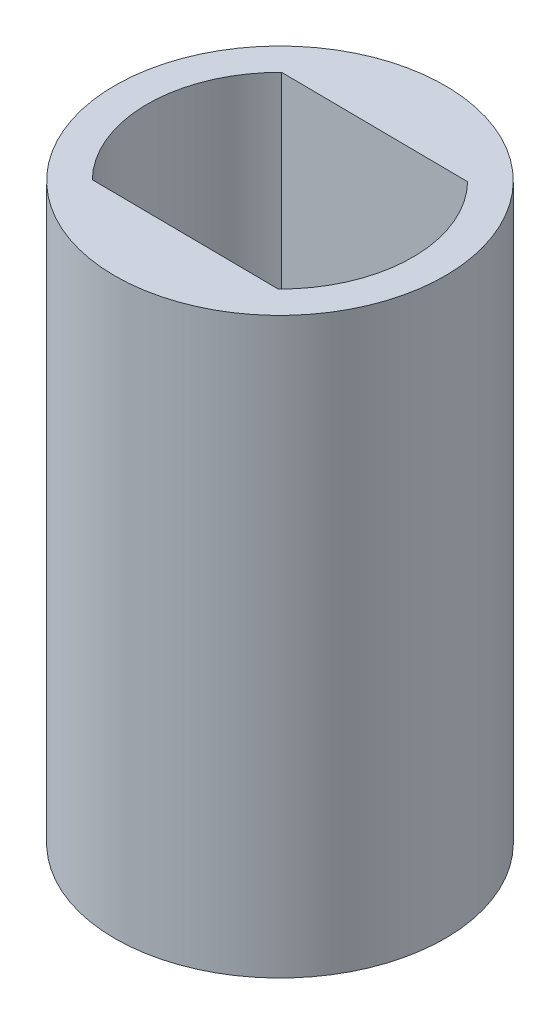
ISO-10303-21;
HEADER;
FILE_DESCRIPTION(('STEP AP214'),'2;1');
FILE_NAME('part.step','',(''),(''),'','','');
FILE_SCHEMA(('AUTOMOTIVE_DESIGN { 1 0 10303 214 1 1 1 1 }'));
ENDSEC;
DATA;
#1=APPLICATION_CONTEXT('core data for automotive mechanical design processes');
#2=APPLICATION_PROTOCOL_DEFINITION('international standard','automotive_design',2000,#1);
#3=PRODUCT_CONTEXT('',#1,'mechanical');
#4=PRODUCT('Part','Part','',(#3));
#5=PRODUCT_RELATED_PRODUCT_CATEGORY('part','',(#4));
#6=PRODUCT_DEFINITION_FORMATION('','',#4);
#7=PRODUCT_DEFINITION_CONTEXT('part definition',#1,'design');
#8=PRODUCT_DEFINITION('design','',#6,#7);
#9=PRODUCT_DEFINITION_SHAPE('','',#8);
#10=(LENGTH_UNIT() NAMED_UNIT(*) SI_UNIT(.MILLI.,.METRE.));
#11=(NAMED_UNIT(*) PLANE_ANGLE_UNIT() SI_UNIT($,.RADIAN.));
#12=(NAMED_UNIT(*) SI_UNIT($,.STERADIAN.) SOLID_ANGLE_UNIT());
#13=UNCERTAINTY_MEASURE_WITH_UNIT(LENGTH_MEASURE(1.E-05),#10,'distance_accuracy_value','');
#14=(GEOMETRIC_REPRESENTATION_CONTEXT(3) GLOBAL_UNCERTAINTY_ASSIGNED_CONTEXT((#13)) GLOBAL_UNIT_ASSIGNED_CONTEXT((#10,
#11,#12)) REPRESENTATION_CONTEXT('',''));
#15=CARTESIAN_POINT('',(0.,0.,0.));
#16=DIRECTION('',(0.,0.,1.));
#17=DIRECTION('',(1.,0.,0.));
#18=AXIS2_PLACEMENT_3D('',#15,#16,#17);
#19=CARTESIAN_POINT('',(0.,6.,0.));
#20=DIRECTION('',(0.,1.,0.));
#21=DIRECTION('',(0.,0.,1.));
#22=AXIS2_PLACEMENT_3D('',#19,#20,#21);
#23=PLANE('',#22);
#24=DIRECTION('',(1.,0.,0.));
#25=VECTOR('',#24,1.);
#26=CARTESIAN_POINT('',(0.,6.,0.95));
#27=LINE('',#26,#25);
#28=CARTESIAN_POINT('',(0.95,6.,0.95));
#29=VERTEX_POINT('',#28);
#30=CARTESIAN_POINT('',(2.44,6.,0.95));
#31=VERTEX_POINT('',#30);
#32=EDGE_CURVE('E202',#29,#31,#27,.T.);
#33=ORIENTED_EDGE('',*,*,#32,.F.);
#34=DIRECTION('',(0.,0.,1.));
#35=VECTOR('',#34,1.);
#36=CARTESIAN_POINT('',(0.95,6.,0.));
#37=LINE('',#36,#35);
#38=CARTESIAN_POINT('',(0.95,6.,1.97121051126905));
#39=VERTEX_POINT('',#38);
#40=EDGE_CURVE('E205',#29,#39,#37,.T.);
#41=ORIENTED_EDGE('',*,*,#40,.T.);
#42=DIRECTION('',(-0.999956089376776,0.,-0.00937119620456276));
#43=VECTOR('',#42,1.);
#44=CARTESIAN_POINT('',(-0.0183883609658107,6.,1.96213515543169));
#45=LINE('',#44,#43);
#46=CARTESIAN_POINT('',(1.9437467944659,6.,1.9805235163975));
#47=VERTEX_POINT('',#46);
#48=EDGE_CURVE('E264',#47,#39,#45,.T.);
#49=ORIENTED_EDGE('',*,*,#48,.F.);
#50=CARTESIAN_POINT('',(0.,6.,0.));
#51=DIRECTION('',(0.,1.,0.));
#52=DIRECTION('',(0.,0.,1.));
#53=AXIS2_PLACEMENT_3D('',#50,#51,#52);
#54=CIRCLE('',#53,2.775);
#55=CARTESIAN_POINT('',(1.9805235163975,6.,-1.94374679446591));
#56=VERTEX_POINT('',#55);
#57=EDGE_CURVE('E267',#47,#56,#54,.T.);
#58=ORIENTED_EDGE('',*,*,#57,.T.);
#59=DIRECTION('',(-0.999956089376777,0.,-0.00937119620454811));
#60=VECTOR('',#59,1.);
#61=CARTESIAN_POINT('',(0.0183883609657819,6.,-1.96213515543169));
#62=LINE('',#61,#60);
#63=CARTESIAN_POINT('',(0.95,6.,-1.95340445660543));
#64=VERTEX_POINT('',#63);
#65=EDGE_CURVE('E273',#56,#64,#62,.T.);
#66=ORIENTED_EDGE('',*,*,#65,.T.);
#67=DIRECTION('',(0.,0.,1.));
#68=VECTOR('',#67,1.);
#69=CARTESIAN_POINT('',(0.95,6.,0.));
#70=LINE('',#69,#68);
#71=CARTESIAN_POINT('',(0.95,6.,-0.95));
#72=VERTEX_POINT('',#71);
#73=EDGE_CURVE('E193',#64,#72,#70,.T.);
#74=ORIENTED_EDGE('',*,*,#73,.T.);
#75=DIRECTION('',(1.,0.,0.));
#76=VECTOR('',#75,1.);
#77=CARTESIAN_POINT('',(0.,6.,-0.95));
#78=LINE('',#77,#76);
#79=CARTESIAN_POINT('',(2.44,6.,-0.95));
#80=VERTEX_POINT('',#79);
#81=EDGE_CURVE('E197',#72,#80,#78,.T.);
#82=ORIENTED_EDGE('',*,*,#81,.T.);
#83=DIRECTION('',(0.,0.,-1.));
#84=VECTOR('',#83,1.);
#85=CARTESIAN_POINT('',(2.44,6.,0.));
#86=LINE('',#85,#84);
#87=EDGE_CURVE('E200',#31,#80,#86,.T.);
#88=ORIENTED_EDGE('',*,*,#87,.F.);
#89=EDGE_LOOP('',(#33,#41,#49,#58,#66,#74,#82,#88));
#90=FACE_BOUND('',#89,.T.);
#91=ADVANCED_FACE('F33',(#90),#23,.T.);
#92=CARTESIAN_POINT('',(0.,0.,0.));
#93=DIRECTION('',(0.,1.,0.));
#94=DIRECTION('',(0.,0.,1.));
#95=AXIS2_PLACEMENT_3D('',#92,#93,#94);
#96=PLANE('',#95);
#97=CARTESIAN_POINT('',(0.,0.,0.));
#98=DIRECTION('',(0.,1.,0.));
#99=DIRECTION('',(0.,0.,1.));
#100=AXIS2_PLACEMENT_3D('',#97,#98,#99);
#101=CIRCLE('',#100,3.45);
#102=CARTESIAN_POINT('',(0.,0.,3.45));
#103=VERTEX_POINT('',#102);
#104=EDGE_CURVE('E37',#103,#103,#101,.T.);
#105=ORIENTED_EDGE('',*,*,#104,.F.);
#106=EDGE_LOOP('',(#105));
#107=FACE_BOUND('',#106,.T.);
#108=DIRECTION('',(0.,0.,1.));
#109=VECTOR('',#108,1.);
#110=CARTESIAN_POINT('',(-0.95,0.,0.));
#111=LINE('',#110,#109);
#112=CARTESIAN_POINT('',(-0.95,0.,0.95));
#113=VERTEX_POINT('',#112);
#114=CARTESIAN_POINT('',(-0.95,0.,2.44));
#115=VERTEX_POINT('',#114);
#116=EDGE_CURVE('E56',#113,#115,#111,.T.);
#117=ORIENTED_EDGE('',*,*,#116,.T.);
#118=DIRECTION('',(1.,0.,0.));
#119=VECTOR('',#118,1.);
#120=CARTESIAN_POINT('',(0.,0.,2.44));
#121=LINE('',#120,#119);
#122=CARTESIAN_POINT('',(0.95,0.,2.44));
#123=VERTEX_POINT('',#122);
#124=EDGE_CURVE('E180',#115,#123,#121,.T.);
#125=ORIENTED_EDGE('',*,*,#124,.T.);
#126=DIRECTION('',(0.,0.,1.));
#127=VECTOR('',#126,1.);
#128=CARTESIAN_POINT('',(0.95,0.,0.));
#129=LINE('',#128,#127);
#130=CARTESIAN_POINT('',(0.95,0.,0.95));
#131=VERTEX_POINT('',#130);
#132=EDGE_CURVE('E237',#131,#123,#129,.T.);
#133=ORIENTED_EDGE('',*,*,#132,.F.);
#134=DIRECTION('',(1.,0.,0.));
#135=VECTOR('',#134,1.);
#136=CARTESIAN_POINT('',(0.,0.,0.95));
#137=LINE('',#136,#135);
#138=CARTESIAN_POINT('',(2.44,0.,0.95));
#139=VERTEX_POINT('',#138);
#140=EDGE_CURVE('E234',#131,#139,#137,.T.);
#141=ORIENTED_EDGE('',*,*,#140,.T.);
#142=DIRECTION('',(0.,0.,-1.));
#143=VECTOR('',#142,1.);
#144=CARTESIAN_POINT('',(2.44,0.,0.));
#145=LINE('',#144,#143);
#146=CARTESIAN_POINT('',(2.44,0.,-0.95));
#147=VERTEX_POINT('',#146);
#148=EDGE_CURVE('E231',#139,#147,#145,.T.);
#149=ORIENTED_EDGE('',*,*,#148,.T.);
#150=DIRECTION('',(1.,0.,0.));
#151=VECTOR('',#150,1.);
#152=CARTESIAN_POINT('',(0.,0.,-0.95));
#153=LINE('',#152,#151);
#154=CARTESIAN_POINT('',(0.95,0.,-0.95));
#155=VERTEX_POINT('',#154);
#156=EDGE_CURVE('E228',#155,#147,#153,.T.);
#157=ORIENTED_EDGE('',*,*,#156,.F.);
#158=DIRECTION('',(0.,0.,1.));
#159=VECTOR('',#158,1.);
#160=CARTESIAN_POINT('',(0.95,0.,0.));
#161=LINE('',#160,#159);
#162=CARTESIAN_POINT('',(0.95,0.,-2.44));
#163=VERTEX_POINT('',#162);
#164=EDGE_CURVE('E225',#163,#155,#161,.T.);
#165=ORIENTED_EDGE('',*,*,#164,.F.);
#166=DIRECTION('',(1.,0.,0.));
#167=VECTOR('',#166,1.);
#168=CARTESIAN_POINT('',(0.,0.,-2.44));
#169=LINE('',#168,#167);
#170=CARTESIAN_POINT('',(-0.95,0.,-2.44));
#171=VERTEX_POINT('',#170);
#172=EDGE_CURVE('E222',#171,#163,#169,.T.);
#173=ORIENTED_EDGE('',*,*,#172,.F.);
#174=DIRECTION('',(0.,0.,1.));
#175=VECTOR('',#174,1.);
#176=CARTESIAN_POINT('',(-0.95,0.,0.));
#177=LINE('',#176,#175);
#178=CARTESIAN_POINT('',(-0.95,0.,-0.95));
#179=VERTEX_POINT('',#178);
#180=EDGE_CURVE('E219',#171,#179,#177,.T.);
#181=ORIENTED_EDGE('',*,*,#180,.T.);
#182=DIRECTION('',(1.,0.,0.));
#183=VECTOR('',#182,1.);
#184=CARTESIAN_POINT('',(0.,0.,-0.95));
#185=LINE('',#184,#183);
#186=CARTESIAN_POINT('',(-2.44,0.,-0.95));
#187=VERTEX_POINT('',#186);
#188=EDGE_CURVE('E216',#187,#179,#185,.T.);
#189=ORIENTED_EDGE('',*,*,#188,.F.);
#190=DIRECTION('',(0.,0.,-1.));
#191=VECTOR('',#190,1.);
#192=CARTESIAN_POINT('',(-2.44,0.,0.));
#193=LINE('',#192,#191);
#194=CARTESIAN_POINT('',(-2.44,0.,0.95));
#195=VERTEX_POINT('',#194);
#196=EDGE_CURVE('E213',#195,#187,#193,.T.);
#197=ORIENTED_EDGE('',*,*,#196,.F.);
#198=DIRECTION('',(1.,0.,0.));
#199=VECTOR('',#198,1.);
#200=CARTESIAN_POINT('',(0.,0.,0.95));
#201=LINE('',#200,#199);
#202=EDGE_CURVE('E211',#195,#113,#201,.T.);
#203=ORIENTED_EDGE('',*,*,#202,.T.);
#204=EDGE_LOOP('',(#117,#125,#133,#141,#149,#157,#165,#173,#181,#189,#197,#203));
#205=FACE_BOUND('',#204,.T.);
#206=ADVANCED_FACE('F331',(#107,#205),#96,.F.);
#207=CARTESIAN_POINT('',(0.,12.,0.));
#208=DIRECTION('',(0.,1.,0.));
#209=DIRECTION('',(0.,0.,1.));
#210=AXIS2_PLACEMENT_3D('',#207,#208,#209);
#211=PLANE('',#210);
#212=CARTESIAN_POINT('',(0.,12.,0.));
#213=DIRECTION('',(0.,1.,0.));
#214=DIRECTION('',(0.,0.,1.));
#215=AXIS2_PLACEMENT_3D('',#212,#213,#214);
#216=CIRCLE('',#215,3.45);
#217=CARTESIAN_POINT('',(0.,12.,3.45));
#218=VERTEX_POINT('',#217);
#219=EDGE_CURVE('E11',#218,#218,#216,.T.);
#220=ORIENTED_EDGE('',*,*,#219,.T.);
#221=EDGE_LOOP('',(#220));
#222=FACE_BOUND('',#221,.T.);
#223=CARTESIAN_POINT('',(0.,12.,0.));
#224=DIRECTION('',(0.,1.,0.));
#225=DIRECTION('',(0.,0.,1.));
#226=AXIS2_PLACEMENT_3D('',#223,#224,#225);
#227=CIRCLE('',#226,2.775);
#228=CARTESIAN_POINT('',(1.9437467944659,12.,1.9805235163975));
#229=VERTEX_POINT('',#228);
#230=CARTESIAN_POINT('',(1.9805235163975,12.,-1.94374679446591));
#231=VERTEX_POINT('',#230);
#232=EDGE_CURVE('E279',#229,#231,#227,.T.);
#233=ORIENTED_EDGE('',*,*,#232,.F.);
#234=DIRECTION('',(-0.999956089376776,0.,-0.00937119620456276));
#235=VECTOR('',#234,1.);
#236=CARTESIAN_POINT('',(-0.0183883609658107,12.,1.96213515543169));
#237=LINE('',#236,#235);
#238=CARTESIAN_POINT('',(-1.98052351639752,12.,1.94374679446588));
#239=VERTEX_POINT('',#238);
#240=EDGE_CURVE('E244',#229,#239,#237,.T.);
#241=ORIENTED_EDGE('',*,*,#240,.T.);
#242=CARTESIAN_POINT('',(-1.94374679446593,12.,-1.98052351639747));
#243=VERTEX_POINT('',#242);
#244=EDGE_CURVE('E283',#243,#239,#227,.T.);
#245=ORIENTED_EDGE('',*,*,#244,.F.);
#246=DIRECTION('',(-0.999956089376777,0.,-0.00937119620454811));
#247=VECTOR('',#246,1.);
#248=CARTESIAN_POINT('',(0.0183883609657819,12.,-1.96213515543169));
#249=LINE('',#248,#247);
#250=EDGE_CURVE('E282',#231,#243,#249,.T.);
#251=ORIENTED_EDGE('',*,*,#250,.F.);
#252=EDGE_LOOP('',(#233,#241,#245,#251));
#253=FACE_BOUND('',#252,.T.);
#254=ADVANCED_FACE('F350',(#222,#253),#211,.T.);
#255=CARTESIAN_POINT('',(0.,12.,0.));
#256=DIRECTION('',(0.,-1.,0.));
#257=DIRECTION('',(0.,0.,-1.));
#258=AXIS2_PLACEMENT_3D('',#255,#256,#257);
#259=CYLINDRICAL_SURFACE('',#258,3.45);
#260=ORIENTED_EDGE('',*,*,#219,.F.);
#261=EDGE_LOOP('',(#260));
#262=FACE_BOUND('',#261,.T.);
#263=ORIENTED_EDGE('',*,*,#104,.T.);
#264=EDGE_LOOP('',(#263));
#265=FACE_BOUND('',#264,.T.);
#266=ADVANCED_FACE('F35',(#262,#265),#259,.T.);
#267=CARTESIAN_POINT('',(-0.0183883609658107,6.,1.96213515543169));
#268=DIRECTION('',(0.00937119620456275,0.,-0.999956089376776));
#269=DIRECTION('',(-0.999956089376776,0.,-0.00937119620456275));
#270=AXIS2_PLACEMENT_3D('',#267,#268,#269);
#271=PLANE('',#270);
#272=ORIENTED_EDGE('',*,*,#240,.F.);
#273=DIRECTION('',(0.,1.,0.));
#274=VECTOR('',#273,1.);
#275=CARTESIAN_POINT('',(1.9437467944659,6.,1.9805235163975));
#276=LINE('',#275,#274);
#277=EDGE_CURVE('E292',#47,#229,#276,.T.);
#278=ORIENTED_EDGE('',*,*,#277,.F.);
#279=ORIENTED_EDGE('',*,*,#48,.T.);
#280=CARTESIAN_POINT('',(-0.95,6.,1.95340445660542));
#281=VERTEX_POINT('',#280);
#282=EDGE_CURVE('E268',#39,#281,#45,.T.);
#283=ORIENTED_EDGE('',*,*,#282,.T.);
#284=CARTESIAN_POINT('',(-1.98052351639752,6.,1.94374679446588));
#285=VERTEX_POINT('',#284);
#286=EDGE_CURVE('E176',#281,#285,#45,.T.);
#287=ORIENTED_EDGE('',*,*,#286,.T.);
#288=DIRECTION('',(0.,1.,0.));
#289=VECTOR('',#288,1.);
#290=CARTESIAN_POINT('',(-1.98052351639752,6.,1.94374679446588));
#291=LINE('',#290,#289);
#292=EDGE_CURVE('E286',#285,#239,#291,.T.);
#293=ORIENTED_EDGE('',*,*,#292,.T.);
#294=EDGE_LOOP('',(#272,#278,#279,#283,#287,#293));
#295=FACE_BOUND('',#294,.T.);
#296=ADVANCED_FACE('F307',(#295),#271,.T.);
#297=CARTESIAN_POINT('',(0.,6.,0.));
#298=DIRECTION('',(0.,1.,0.));
#299=DIRECTION('',(0.,0.,1.));
#300=AXIS2_PLACEMENT_3D('',#297,#298,#299);
#301=CYLINDRICAL_SURFACE('',#300,2.775);
#302=ORIENTED_EDGE('',*,*,#244,.T.);
#303=ORIENTED_EDGE('',*,*,#292,.F.);
#304=CARTESIAN_POINT('',(-1.94374679446593,6.,-1.98052351639747));
#305=VERTEX_POINT('',#304);
#306=EDGE_CURVE('E272',#305,#285,#54,.T.);
#307=ORIENTED_EDGE('',*,*,#306,.F.);
#308=DIRECTION('',(0.,1.,0.));
#309=VECTOR('',#308,1.);
#310=CARTESIAN_POINT('',(-1.94374679446593,6.,-1.98052351639747));
#311=LINE('',#310,#309);
#312=EDGE_CURVE('E288',#305,#243,#311,.T.);
#313=ORIENTED_EDGE('',*,*,#312,.T.);
#314=EDGE_LOOP('',(#302,#303,#307,#313));
#315=FACE_BOUND('',#314,.T.);
#316=ADVANCED_FACE('F304',(#315),#301,.F.);
#317=CARTESIAN_POINT('',(0.0183883609657819,6.,-1.96213515543169));
#318=DIRECTION('',(0.00937119620454811,0.,-0.999956089376777));
#319=DIRECTION('',(-0.999956089376777,0.,-0.00937119620454811));
#320=AXIS2_PLACEMENT_3D('',#317,#318,#319);
#321=PLANE('',#320);
#322=ORIENTED_EDGE('',*,*,#250,.T.);
#323=ORIENTED_EDGE('',*,*,#312,.F.);
#324=CARTESIAN_POINT('',(-0.95,6.,-1.97121051126903));
#325=VERTEX_POINT('',#324);
#326=EDGE_CURVE('E271',#325,#305,#62,.T.);
#327=ORIENTED_EDGE('',*,*,#326,.F.);
#328=EDGE_CURVE('E276',#64,#325,#62,.T.);
#329=ORIENTED_EDGE('',*,*,#328,.F.);
#330=ORIENTED_EDGE('',*,*,#65,.F.);
#331=DIRECTION('',(0.,1.,0.));
#332=VECTOR('',#331,1.);
#333=CARTESIAN_POINT('',(1.9805235163975,6.,-1.94374679446591));
#334=LINE('',#333,#332);
#335=EDGE_CURVE('E290',#56,#231,#334,.T.);
#336=ORIENTED_EDGE('',*,*,#335,.T.);
#337=EDGE_LOOP('',(#322,#323,#327,#329,#330,#336));
#338=FACE_BOUND('',#337,.T.);
#339=ADVANCED_FACE('F360',(#338),#321,.F.);
#340=ORIENTED_EDGE('',*,*,#232,.T.);
#341=ORIENTED_EDGE('',*,*,#335,.F.);
#342=ORIENTED_EDGE('',*,*,#57,.F.);
#343=ORIENTED_EDGE('',*,*,#277,.T.);
#344=EDGE_LOOP('',(#340,#341,#342,#343));
#345=FACE_BOUND('',#344,.T.);
#346=ADVANCED_FACE('F354',(#345),#301,.F.);
#347=DIRECTION('',(0.,0.,1.));
#348=VECTOR('',#347,1.);
#349=CARTESIAN_POINT('',(-0.95,6.,0.));
#350=LINE('',#349,#348);
#351=CARTESIAN_POINT('',(-0.95,6.,0.95));
#352=VERTEX_POINT('',#351);
#353=EDGE_CURVE('E167',#352,#281,#350,.T.);
#354=ORIENTED_EDGE('',*,*,#353,.F.);
#355=DIRECTION('',(1.,0.,0.));
#356=VECTOR('',#355,1.);
#357=CARTESIAN_POINT('',(0.,6.,0.95));
#358=LINE('',#357,#356);
#359=CARTESIAN_POINT('',(-2.44,6.,0.95));
#360=VERTEX_POINT('',#359);
#361=EDGE_CURVE('E159',#360,#352,#358,.T.);
#362=ORIENTED_EDGE('',*,*,#361,.F.);
#363=DIRECTION('',(0.,0.,-1.));
#364=VECTOR('',#363,1.);
#365=CARTESIAN_POINT('',(-2.44,6.,0.));
#366=LINE('',#365,#364);
#367=CARTESIAN_POINT('',(-2.44,6.,-0.95));
#368=VERTEX_POINT('',#367);
#369=EDGE_CURVE('E48',#360,#368,#366,.T.);
#370=ORIENTED_EDGE('',*,*,#369,.T.);
#371=DIRECTION('',(1.,0.,0.));
#372=VECTOR('',#371,1.);
#373=CARTESIAN_POINT('',(0.,6.,-0.95));
#374=LINE('',#373,#372);
#375=CARTESIAN_POINT('',(-0.95,6.,-0.95));
#376=VERTEX_POINT('',#375);
#377=EDGE_CURVE('E183',#368,#376,#374,.T.);
#378=ORIENTED_EDGE('',*,*,#377,.T.);
#379=DIRECTION('',(0.,0.,1.));
#380=VECTOR('',#379,1.);
#381=CARTESIAN_POINT('',(-0.95,6.,0.));
#382=LINE('',#381,#380);
#383=EDGE_CURVE('E186',#325,#376,#382,.T.);
#384=ORIENTED_EDGE('',*,*,#383,.F.);
#385=ORIENTED_EDGE('',*,*,#326,.T.);
#386=ORIENTED_EDGE('',*,*,#306,.T.);
#387=ORIENTED_EDGE('',*,*,#286,.F.);
#388=EDGE_LOOP('',(#354,#362,#370,#378,#384,#385,#386,#387));
#389=FACE_BOUND('',#388,.T.);
#390=ADVANCED_FACE('F174',(#389),#23,.T.);
#391=CARTESIAN_POINT('',(0.,6.,0.));
#392=DIRECTION('',(0.,-1.,0.));
#393=DIRECTION('',(0.,0.,-1.));
#394=AXIS2_PLACEMENT_3D('',#391,#392,#393);
#395=PLANE('',#394);
#396=ORIENTED_EDGE('',*,*,#328,.T.);
#397=CARTESIAN_POINT('',(-0.95,6.,-2.44));
#398=VERTEX_POINT('',#397);
#399=EDGE_CURVE('E187',#398,#325,#382,.T.);
#400=ORIENTED_EDGE('',*,*,#399,.F.);
#401=DIRECTION('',(1.,0.,0.));
#402=VECTOR('',#401,1.);
#403=CARTESIAN_POINT('',(0.,6.,-2.44));
#404=LINE('',#403,#402);
#405=CARTESIAN_POINT('',(0.95,6.,-2.44));
#406=VERTEX_POINT('',#405);
#407=EDGE_CURVE('E190',#398,#406,#404,.T.);
#408=ORIENTED_EDGE('',*,*,#407,.T.);
#409=EDGE_CURVE('E194',#406,#64,#70,.T.);
#410=ORIENTED_EDGE('',*,*,#409,.T.);
#411=EDGE_LOOP('',(#396,#400,#408,#410));
#412=FACE_BOUND('',#411,.T.);
#413=ADVANCED_FACE('F342',(#412),#395,.T.);
#414=CARTESIAN_POINT('',(-0.95,6.,0.));
#415=DIRECTION('',(1.,0.,0.));
#416=DIRECTION('',(0.,0.,-1.));
#417=AXIS2_PLACEMENT_3D('',#414,#415,#416);
#418=PLANE('',#417);
#419=ORIENTED_EDGE('',*,*,#116,.F.);
#420=DIRECTION('',(0.,-1.,0.));
#421=VECTOR('',#420,1.);
#422=CARTESIAN_POINT('',(-0.95,6.,0.95));
#423=LINE('',#422,#421);
#424=EDGE_CURVE('E162',#352,#113,#423,.T.);
#425=ORIENTED_EDGE('',*,*,#424,.F.);
#426=ORIENTED_EDGE('',*,*,#353,.T.);
#427=CARTESIAN_POINT('',(-0.95,6.,2.44));
#428=VERTEX_POINT('',#427);
#429=EDGE_CURVE('E178',#281,#428,#350,.T.);
#430=ORIENTED_EDGE('',*,*,#429,.T.);
#431=DIRECTION('',(0.,-1.,0.));
#432=VECTOR('',#431,1.);
#433=CARTESIAN_POINT('',(-0.95,6.,2.44));
#434=LINE('',#433,#432);
#435=EDGE_CURVE('E242',#428,#115,#434,.T.);
#436=ORIENTED_EDGE('',*,*,#435,.T.);
#437=EDGE_LOOP('',(#419,#425,#426,#430,#436));
#438=FACE_BOUND('',#437,.T.);
#439=ADVANCED_FACE('F170',(#438),#418,.T.);
#440=CARTESIAN_POINT('',(0.,6.,2.44));
#441=DIRECTION('',(0.,0.,-1.));
#442=DIRECTION('',(-1.,0.,0.));
#443=AXIS2_PLACEMENT_3D('',#440,#441,#442);
#444=PLANE('',#443);
#445=ORIENTED_EDGE('',*,*,#124,.F.);
#446=ORIENTED_EDGE('',*,*,#435,.F.);
#447=DIRECTION('',(1.,0.,0.));
#448=VECTOR('',#447,1.);
#449=CARTESIAN_POINT('',(0.,6.,2.44));
#450=LINE('',#449,#448);
#451=CARTESIAN_POINT('',(0.95,6.,2.44));
#452=VERTEX_POINT('',#451);
#453=EDGE_CURVE('E172',#428,#452,#450,.T.);
#454=ORIENTED_EDGE('',*,*,#453,.T.);
#455=DIRECTION('',(0.,-1.,0.));
#456=VECTOR('',#455,1.);
#457=CARTESIAN_POINT('',(0.95,6.,2.44));
#458=LINE('',#457,#456);
#459=EDGE_CURVE('E245',#452,#123,#458,.T.);
#460=ORIENTED_EDGE('',*,*,#459,.T.);
#461=EDGE_LOOP('',(#445,#446,#454,#460));
#462=FACE_BOUND('',#461,.T.);
#463=ADVANCED_FACE('F334',(#462),#444,.T.);
#464=CARTESIAN_POINT('',(0.95,6.,0.));
#465=DIRECTION('',(1.,0.,0.));
#466=DIRECTION('',(0.,0.,-1.));
#467=AXIS2_PLACEMENT_3D('',#464,#465,#466);
#468=PLANE('',#467);
#469=ORIENTED_EDGE('',*,*,#132,.T.);
#470=ORIENTED_EDGE('',*,*,#459,.F.);
#471=EDGE_CURVE('E204',#39,#452,#37,.T.);
#472=ORIENTED_EDGE('',*,*,#471,.F.);
#473=ORIENTED_EDGE('',*,*,#40,.F.);
#474=DIRECTION('',(0.,-1.,0.));
#475=VECTOR('',#474,1.);
#476=CARTESIAN_POINT('',(0.95,6.,0.95));
#477=LINE('',#476,#475);
#478=EDGE_CURVE('E247',#29,#131,#477,.T.);
#479=ORIENTED_EDGE('',*,*,#478,.T.);
#480=EDGE_LOOP('',(#469,#470,#472,#473,#479));
#481=FACE_BOUND('',#480,.T.);
#482=ADVANCED_FACE('F316',(#481),#468,.F.);
#483=CARTESIAN_POINT('',(0.,6.,0.95));
#484=DIRECTION('',(0.,0.,-1.));
#485=DIRECTION('',(-1.,0.,0.));
#486=AXIS2_PLACEMENT_3D('',#483,#484,#485);
#487=PLANE('',#486);
#488=ORIENTED_EDGE('',*,*,#140,.F.);
#489=ORIENTED_EDGE('',*,*,#478,.F.);
#490=ORIENTED_EDGE('',*,*,#32,.T.);
#491=DIRECTION('',(0.,-1.,0.));
#492=VECTOR('',#491,1.);
#493=CARTESIAN_POINT('',(2.44,6.,0.95));
#494=LINE('',#493,#492);
#495=EDGE_CURVE('E249',#31,#139,#494,.T.);
#496=ORIENTED_EDGE('',*,*,#495,.T.);
#497=EDGE_LOOP('',(#488,#489,#490,#496));
#498=FACE_BOUND('',#497,.T.);
#499=ADVANCED_FACE('F323',(#498),#487,.T.);
#500=CARTESIAN_POINT('',(2.44,6.,0.));
#501=DIRECTION('',(-1.,0.,0.));
#502=DIRECTION('',(0.,0.,1.));
#503=AXIS2_PLACEMENT_3D('',#500,#501,#502);
#504=PLANE('',#503);
#505=ORIENTED_EDGE('',*,*,#148,.F.);
#506=ORIENTED_EDGE('',*,*,#495,.F.);
#507=ORIENTED_EDGE('',*,*,#87,.T.);
#508=DIRECTION('',(0.,-1.,0.));
#509=VECTOR('',#508,1.);
#510=CARTESIAN_POINT('',(2.44,6.,-0.95));
#511=LINE('',#510,#509);
#512=EDGE_CURVE('E251',#80,#147,#511,.T.);
#513=ORIENTED_EDGE('',*,*,#512,.T.);
#514=EDGE_LOOP('',(#505,#506,#507,#513));
#515=FACE_BOUND('',#514,.T.);
#516=ADVANCED_FACE('F326',(#515),#504,.T.);
#517=CARTESIAN_POINT('',(0.,6.,-0.95));
#518=DIRECTION('',(0.,0.,-1.));
#519=DIRECTION('',(-1.,0.,0.));
#520=AXIS2_PLACEMENT_3D('',#517,#518,#519);
#521=PLANE('',#520);
#522=ORIENTED_EDGE('',*,*,#156,.T.);
#523=ORIENTED_EDGE('',*,*,#512,.F.);
#524=ORIENTED_EDGE('',*,*,#81,.F.);
#525=DIRECTION('',(0.,-1.,0.));
#526=VECTOR('',#525,1.);
#527=CARTESIAN_POINT('',(0.95,6.,-0.95));
#528=LINE('',#527,#526);
#529=EDGE_CURVE('E253',#72,#155,#528,.T.);
#530=ORIENTED_EDGE('',*,*,#529,.T.);
#531=EDGE_LOOP('',(#522,#523,#524,#530));
#532=FACE_BOUND('',#531,.T.);
#533=ADVANCED_FACE('F398',(#532),#521,.F.);
#534=CARTESIAN_POINT('',(0.95,6.,0.));
#535=DIRECTION('',(1.,0.,0.));
#536=DIRECTION('',(0.,0.,-1.));
#537=AXIS2_PLACEMENT_3D('',#534,#535,#536);
#538=PLANE('',#537);
#539=ORIENTED_EDGE('',*,*,#164,.T.);
#540=ORIENTED_EDGE('',*,*,#529,.F.);
#541=ORIENTED_EDGE('',*,*,#73,.F.);
#542=ORIENTED_EDGE('',*,*,#409,.F.);
#543=DIRECTION('',(0.,-1.,0.));
#544=VECTOR('',#543,1.);
#545=CARTESIAN_POINT('',(0.95,6.,-2.44));
#546=LINE('',#545,#544);
#547=EDGE_CURVE('E255',#406,#163,#546,.T.);
#548=ORIENTED_EDGE('',*,*,#547,.T.);
#549=EDGE_LOOP('',(#539,#540,#541,#542,#548));
#550=FACE_BOUND('',#549,.T.);
#551=ADVANCED_FACE('F389',(#550),#538,.F.);
#552=CARTESIAN_POINT('',(0.,6.,-2.44));
#553=DIRECTION('',(0.,0.,-1.));
#554=DIRECTION('',(-1.,0.,0.));
#555=AXIS2_PLACEMENT_3D('',#552,#553,#554);
#556=PLANE('',#555);
#557=ORIENTED_EDGE('',*,*,#172,.T.);
#558=ORIENTED_EDGE('',*,*,#547,.F.);
#559=ORIENTED_EDGE('',*,*,#407,.F.);
#560=DIRECTION('',(0.,-1.,0.));
#561=VECTOR('',#560,1.);
#562=CARTESIAN_POINT('',(-0.95,6.,-2.44));
#563=LINE('',#562,#561);
#564=EDGE_CURVE('E257',#398,#171,#563,.T.);
#565=ORIENTED_EDGE('',*,*,#564,.T.);
#566=EDGE_LOOP('',(#557,#558,#559,#565));
#567=FACE_BOUND('',#566,.T.);
#568=ADVANCED_FACE('F393',(#567),#556,.F.);
#569=CARTESIAN_POINT('',(-0.95,6.,0.));
#570=DIRECTION('',(1.,0.,0.));
#571=DIRECTION('',(0.,0.,-1.));
#572=AXIS2_PLACEMENT_3D('',#569,#570,#571);
#573=PLANE('',#572);
#574=ORIENTED_EDGE('',*,*,#180,.F.);
#575=ORIENTED_EDGE('',*,*,#564,.F.);
#576=ORIENTED_EDGE('',*,*,#399,.T.);
#577=ORIENTED_EDGE('',*,*,#383,.T.);
#578=DIRECTION('',(0.,-1.,0.));
#579=VECTOR('',#578,1.);
#580=CARTESIAN_POINT('',(-0.95,6.,-0.95));
#581=LINE('',#580,#579);
#582=EDGE_CURVE('E259',#376,#179,#581,.T.);
#583=ORIENTED_EDGE('',*,*,#582,.T.);
#584=EDGE_LOOP('',(#574,#575,#576,#577,#583));
#585=FACE_BOUND('',#584,.T.);
#586=ADVANCED_FACE('F411',(#585),#573,.T.);
#587=CARTESIAN_POINT('',(0.,6.,-0.95));
#588=DIRECTION('',(0.,0.,-1.));
#589=DIRECTION('',(-1.,0.,0.));
#590=AXIS2_PLACEMENT_3D('',#587,#588,#589);
#591=PLANE('',#590);
#592=ORIENTED_EDGE('',*,*,#188,.T.);
#593=ORIENTED_EDGE('',*,*,#582,.F.);
#594=ORIENTED_EDGE('',*,*,#377,.F.);
#595=DIRECTION('',(0.,-1.,0.));
#596=VECTOR('',#595,1.);
#597=CARTESIAN_POINT('',(-2.44,6.,-0.95));
#598=LINE('',#597,#596);
#599=EDGE_CURVE('E261',#368,#187,#598,.T.);
#600=ORIENTED_EDGE('',*,*,#599,.T.);
#601=EDGE_LOOP('',(#592,#593,#594,#600));
#602=FACE_BOUND('',#601,.T.);
#603=ADVANCED_FACE('F414',(#602),#591,.F.);
#604=CARTESIAN_POINT('',(-2.44,6.,0.));
#605=DIRECTION('',(-1.,0.,0.));
#606=DIRECTION('',(0.,0.,1.));
#607=AXIS2_PLACEMENT_3D('',#604,#605,#606);
#608=PLANE('',#607);
#609=ORIENTED_EDGE('',*,*,#196,.T.);
#610=ORIENTED_EDGE('',*,*,#599,.F.);
#611=ORIENTED_EDGE('',*,*,#369,.F.);
#612=DIRECTION('',(0.,-1.,0.));
#613=VECTOR('',#612,1.);
#614=CARTESIAN_POINT('',(-2.44,6.,0.95));
#615=LINE('',#614,#613);
#616=EDGE_CURVE('E164',#360,#195,#615,.T.);
#617=ORIENTED_EDGE('',*,*,#616,.T.);
#618=EDGE_LOOP('',(#609,#610,#611,#617));
#619=FACE_BOUND('',#618,.T.);
#620=ADVANCED_FACE('F418',(#619),#608,.F.);
#621=CARTESIAN_POINT('',(0.,6.,0.95));
#622=DIRECTION('',(0.,0.,-1.));
#623=DIRECTION('',(-1.,0.,0.));
#624=AXIS2_PLACEMENT_3D('',#621,#622,#623);
#625=PLANE('',#624);
#626=ORIENTED_EDGE('',*,*,#202,.F.);
#627=ORIENTED_EDGE('',*,*,#616,.F.);
#628=ORIENTED_EDGE('',*,*,#361,.T.);
#629=ORIENTED_EDGE('',*,*,#424,.T.);
#630=EDGE_LOOP('',(#626,#627,#628,#629));
#631=FACE_BOUND('',#630,.T.);
#632=ADVANCED_FACE('F161',(#631),#625,.T.);
#633=ORIENTED_EDGE('',*,*,#471,.T.);
#634=ORIENTED_EDGE('',*,*,#453,.F.);
#635=ORIENTED_EDGE('',*,*,#429,.F.);
#636=ORIENTED_EDGE('',*,*,#282,.F.);
#637=EDGE_LOOP('',(#633,#634,#635,#636));
#638=FACE_BOUND('',#637,.T.);
#639=ADVANCED_FACE('F311',(#638),#395,.T.);
#640=CLOSED_SHELL('',(#91,#206,#254,#266,#296,#316,#339,#346,#390,#413,#439,#463,#482,#499,#516,
#533,#551,#568,#586,#603,#620,#632,#639));
#641=MANIFOLD_SOLID_BREP('B2',#640);
#642=ADVANCED_BREP_SHAPE_REPRESENTATION('',(#18,#641),#14);
#643=SHAPE_DEFINITION_REPRESENTATION(#9,#642);
ENDSEC;
END-ISO-10303-21;
